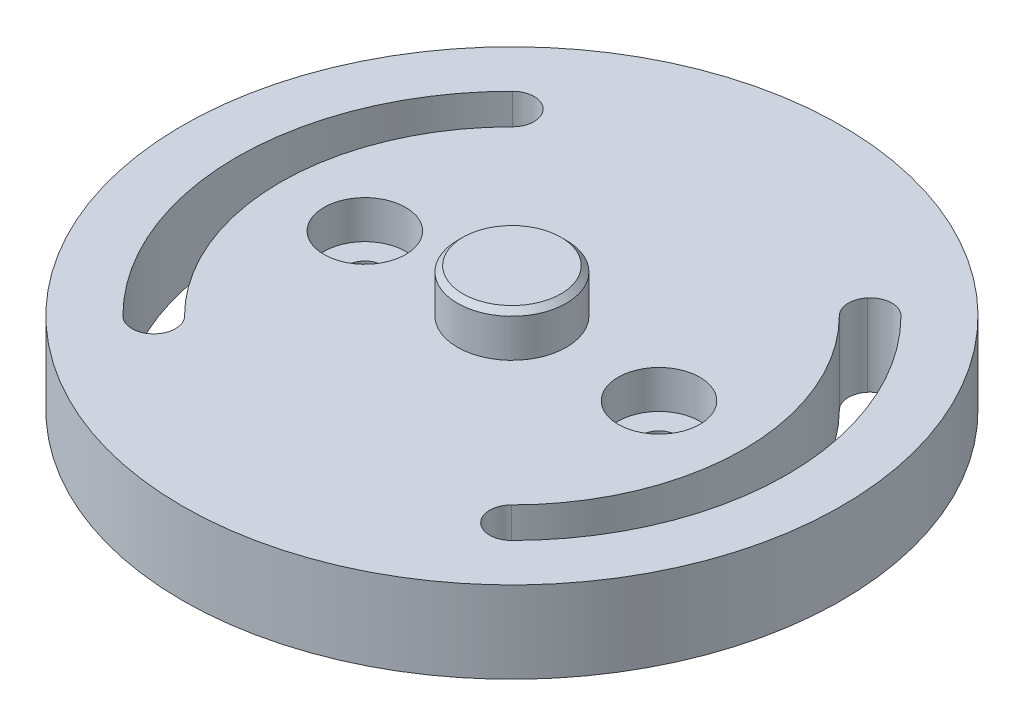
ISO-10303-21;
HEADER;
FILE_DESCRIPTION(('STEP AP214'),'2;1');
FILE_NAME('part.step','',(''),(''),'','','');
FILE_SCHEMA(('AUTOMOTIVE_DESIGN { 1 0 10303 214 1 1 1 1 }'));
ENDSEC;
DATA;
#1=APPLICATION_CONTEXT('core data for automotive mechanical design processes');
#2=APPLICATION_PROTOCOL_DEFINITION('international standard','automotive_design',2000,#1);
#3=PRODUCT_CONTEXT('',#1,'mechanical');
#4=PRODUCT('Part','Part','',(#3));
#5=PRODUCT_RELATED_PRODUCT_CATEGORY('part','',(#4));
#6=PRODUCT_DEFINITION_FORMATION('','',#4);
#7=PRODUCT_DEFINITION_CONTEXT('part definition',#1,'design');
#8=PRODUCT_DEFINITION('design','',#6,#7);
#9=PRODUCT_DEFINITION_SHAPE('','',#8);
#10=(LENGTH_UNIT() NAMED_UNIT(*) SI_UNIT(.MILLI.,.METRE.));
#11=(NAMED_UNIT(*) PLANE_ANGLE_UNIT() SI_UNIT($,.RADIAN.));
#12=(NAMED_UNIT(*) SI_UNIT($,.STERADIAN.) SOLID_ANGLE_UNIT());
#13=UNCERTAINTY_MEASURE_WITH_UNIT(LENGTH_MEASURE(1.E-05),#10,'distance_accuracy_value','');
#14=(GEOMETRIC_REPRESENTATION_CONTEXT(3) GLOBAL_UNCERTAINTY_ASSIGNED_CONTEXT((#13)) GLOBAL_UNIT_ASSIGNED_CONTEXT((#10,
#11,#12)) REPRESENTATION_CONTEXT('',''));
#15=CARTESIAN_POINT('',(0.,0.,0.));
#16=DIRECTION('',(0.,0.,1.));
#17=DIRECTION('',(1.,0.,0.));
#18=AXIS2_PLACEMENT_3D('',#15,#16,#17);
#19=CARTESIAN_POINT('',(0.,15.,0.));
#20=DIRECTION('',(0.,-1.,0.));
#21=DIRECTION('',(0.,0.,-1.));
#22=AXIS2_PLACEMENT_3D('',#19,#20,#21);
#23=CYLINDRICAL_SURFACE('',#22,42.5);
#24=CARTESIAN_POINT('',(0.,15.,0.));
#25=DIRECTION('',(0.,1.,0.));
#26=DIRECTION('',(0.,0.,1.));
#27=AXIS2_PLACEMENT_3D('',#24,#25,#26);
#28=CIRCLE('',#27,42.5);
#29=CARTESIAN_POINT('',(30.0178040791715,15.,30.0862333678458));
#30=VERTEX_POINT('',#29);
#31=CARTESIAN_POINT('',(30.0178040791715,15.,-30.0862333678458));
#32=VERTEX_POINT('',#31);
#33=EDGE_CURVE('E304',#30,#32,#28,.T.);
#34=ORIENTED_EDGE('',*,*,#33,.F.);
#35=DIRECTION('',(0.,-1.,0.));
#36=VECTOR('',#35,1.);
#37=CARTESIAN_POINT('',(30.0178040791715,15.,30.0862333678458));
#38=LINE('',#37,#36);
#39=CARTESIAN_POINT('',(30.0178040791715,0.,30.0862333678458));
#40=VERTEX_POINT('',#39);
#41=EDGE_CURVE('E165',#30,#40,#38,.T.);
#42=ORIENTED_EDGE('',*,*,#41,.T.);
#43=CARTESIAN_POINT('',(0.,0.,0.));
#44=DIRECTION('',(0.,1.,0.));
#45=DIRECTION('',(0.,0.,1.));
#46=AXIS2_PLACEMENT_3D('',#43,#44,#45);
#47=CIRCLE('',#46,42.5);
#48=CARTESIAN_POINT('',(30.0178040791715,0.,-30.0862333678458));
#49=VERTEX_POINT('',#48);
#50=EDGE_CURVE('E159',#40,#49,#47,.T.);
#51=ORIENTED_EDGE('',*,*,#50,.T.);
#52=DIRECTION('',(0.,-1.,0.));
#53=VECTOR('',#52,1.);
#54=CARTESIAN_POINT('',(30.0178040791715,15.,-30.0862333678458));
#55=LINE('',#54,#53);
#56=EDGE_CURVE('E163',#49,#32,#55,.F.);
#57=ORIENTED_EDGE('',*,*,#56,.T.);
#58=EDGE_LOOP('',(#34,#42,#51,#57));
#59=FACE_BOUND('',#58,.T.);
#60=ADVANCED_FACE('F43',(#59),#23,.T.);
#61=CARTESIAN_POINT('',(0.,15.,0.));
#62=DIRECTION('',(0.,-1.,0.));
#63=DIRECTION('',(0.,0.,-1.));
#64=AXIS2_PLACEMENT_3D('',#61,#62,#63);
#65=CYLINDRICAL_SURFACE('',#64,50.5);
#66=CARTESIAN_POINT('',(0.,0.,0.));
#67=DIRECTION('',(0.,1.,0.));
#68=DIRECTION('',(0.,0.,1.));
#69=AXIS2_PLACEMENT_3D('',#66,#67,#68);
#70=CIRCLE('',#69,50.5);
#71=CARTESIAN_POINT('',(35.6682142587802,0.,35.7495243547344));
#72=VERTEX_POINT('',#71);
#73=CARTESIAN_POINT('',(35.6682142587802,0.,-35.7495243547344));
#74=VERTEX_POINT('',#73);
#75=EDGE_CURVE('E139',#72,#74,#70,.T.);
#76=ORIENTED_EDGE('',*,*,#75,.F.);
#77=DIRECTION('',(0.,-1.,0.));
#78=VECTOR('',#77,1.);
#79=CARTESIAN_POINT('',(35.6682142587802,15.,35.7495243547344));
#80=LINE('',#79,#78);
#81=CARTESIAN_POINT('',(35.6682142587802,15.,35.7495243547344));
#82=VERTEX_POINT('',#81);
#83=EDGE_CURVE('E154',#72,#82,#80,.F.);
#84=ORIENTED_EDGE('',*,*,#83,.T.);
#85=CARTESIAN_POINT('',(0.,15.,0.));
#86=DIRECTION('',(0.,1.,0.));
#87=DIRECTION('',(0.,0.,1.));
#88=AXIS2_PLACEMENT_3D('',#85,#86,#87);
#89=CIRCLE('',#88,50.5);
#90=CARTESIAN_POINT('',(35.6682142587802,15.,-35.7495243547344));
#91=VERTEX_POINT('',#90);
#92=EDGE_CURVE('E303',#82,#91,#89,.T.);
#93=ORIENTED_EDGE('',*,*,#92,.T.);
#94=DIRECTION('',(0.,-1.,0.));
#95=VECTOR('',#94,1.);
#96=CARTESIAN_POINT('',(35.6682142587802,15.,-35.7495243547344));
#97=LINE('',#96,#95);
#98=EDGE_CURVE('E157',#91,#74,#97,.T.);
#99=ORIENTED_EDGE('',*,*,#98,.T.);
#100=EDGE_LOOP('',(#76,#84,#93,#99));
#101=FACE_BOUND('',#100,.T.);
#102=ADVANCED_FACE('F152',(#101),#65,.F.);
#103=CARTESIAN_POINT('',(-35.6682142587802,15.,-35.7495243547344));
#104=VERTEX_POINT('',#103);
#105=CARTESIAN_POINT('',(-35.6682142587802,15.,35.7495243547344));
#106=VERTEX_POINT('',#105);
#107=EDGE_CURVE('E276',#104,#106,#89,.T.);
#108=ORIENTED_EDGE('',*,*,#107,.T.);
#109=DIRECTION('',(0.,-1.,0.));
#110=VECTOR('',#109,1.);
#111=CARTESIAN_POINT('',(-35.6682142587802,15.,35.7495243547344));
#112=LINE('',#111,#110);
#113=CARTESIAN_POINT('',(-35.6682142587802,0.,35.7495243547344));
#114=VERTEX_POINT('',#113);
#115=EDGE_CURVE('E147',#106,#114,#112,.T.);
#116=ORIENTED_EDGE('',*,*,#115,.T.);
#117=CARTESIAN_POINT('',(-35.6682142587802,0.,-35.7495243547344));
#118=VERTEX_POINT('',#117);
#119=EDGE_CURVE('E161',#118,#114,#70,.T.);
#120=ORIENTED_EDGE('',*,*,#119,.F.);
#121=DIRECTION('',(0.,-1.,0.));
#122=VECTOR('',#121,1.);
#123=CARTESIAN_POINT('',(-35.6682142587802,15.,-35.7495243547344));
#124=LINE('',#123,#122);
#125=EDGE_CURVE('E178',#118,#104,#124,.F.);
#126=ORIENTED_EDGE('',*,*,#125,.T.);
#127=EDGE_LOOP('',(#108,#116,#120,#126));
#128=FACE_BOUND('',#127,.T.);
#129=ADVANCED_FACE('F239',(#128),#65,.F.);
#130=CARTESIAN_POINT('',(-30.0178040791715,0.,-30.0862333678458));
#131=VERTEX_POINT('',#130);
#132=CARTESIAN_POINT('',(-30.0178040791715,0.,30.0862333678458));
#133=VERTEX_POINT('',#132);
#134=EDGE_CURVE('E255',#131,#133,#47,.T.);
#135=ORIENTED_EDGE('',*,*,#134,.T.);
#136=DIRECTION('',(0.,-1.,0.));
#137=VECTOR('',#136,1.);
#138=CARTESIAN_POINT('',(-30.0178040791715,15.,30.0862333678458));
#139=LINE('',#138,#137);
#140=CARTESIAN_POINT('',(-30.0178040791715,15.,30.0862333678458));
#141=VERTEX_POINT('',#140);
#142=EDGE_CURVE('E175',#133,#141,#139,.F.);
#143=ORIENTED_EDGE('',*,*,#142,.T.);
#144=CARTESIAN_POINT('',(-30.0178040791715,15.,-30.0862333678458));
#145=VERTEX_POINT('',#144);
#146=EDGE_CURVE('E268',#145,#141,#28,.T.);
#147=ORIENTED_EDGE('',*,*,#146,.F.);
#148=DIRECTION('',(0.,-1.,0.));
#149=VECTOR('',#148,1.);
#150=CARTESIAN_POINT('',(-30.0178040791715,15.,-30.0862333678458));
#151=LINE('',#150,#149);
#152=EDGE_CURVE('E172',#145,#131,#151,.T.);
#153=ORIENTED_EDGE('',*,*,#152,.T.);
#154=EDGE_LOOP('',(#135,#143,#147,#153));
#155=FACE_BOUND('',#154,.T.);
#156=ADVANCED_FACE('F235',(#155),#23,.T.);
#157=CARTESIAN_POINT('',(0.,15.,0.));
#158=DIRECTION('',(0.,-1.,0.));
#159=DIRECTION('',(0.,0.,-1.));
#160=AXIS2_PLACEMENT_3D('',#157,#158,#159);
#161=CYLINDRICAL_SURFACE('',#160,60.5);
#162=CARTESIAN_POINT('',(0.,15.,0.));
#163=DIRECTION('',(0.,1.,0.));
#164=DIRECTION('',(0.,0.,1.));
#165=AXIS2_PLACEMENT_3D('',#162,#163,#164);
#166=CIRCLE('',#165,60.5);
#167=CARTESIAN_POINT('',(0.,15.,60.5));
#168=VERTEX_POINT('',#167);
#169=EDGE_CURVE('E167',#168,#168,#166,.T.);
#170=ORIENTED_EDGE('',*,*,#169,.F.);
#171=EDGE_LOOP('',(#170));
#172=FACE_BOUND('',#171,.T.);
#173=CARTESIAN_POINT('',(0.,0.,0.));
#174=DIRECTION('',(0.,1.,0.));
#175=DIRECTION('',(0.,0.,1.));
#176=AXIS2_PLACEMENT_3D('',#173,#174,#175);
#177=CIRCLE('',#176,60.5);
#178=CARTESIAN_POINT('',(0.,0.,60.5));
#179=VERTEX_POINT('',#178);
#180=EDGE_CURVE('E158',#179,#179,#177,.T.);
#181=ORIENTED_EDGE('',*,*,#180,.T.);
#182=EDGE_LOOP('',(#181));
#183=FACE_BOUND('',#182,.T.);
#184=ADVANCED_FACE('F244',(#172,#183),#161,.T.);
#185=CARTESIAN_POINT('',(0.,15.,0.));
#186=DIRECTION('',(0.,1.,0.));
#187=DIRECTION('',(0.,0.,1.));
#188=AXIS2_PLACEMENT_3D('',#185,#186,#187);
#189=PLANE('',#188);
#190=CARTESIAN_POINT('',(0.,15.,0.));
#191=DIRECTION('',(0.,1.,0.));
#192=DIRECTION('',(0.,0.,1.));
#193=AXIS2_PLACEMENT_3D('',#190,#191,#192);
#194=CIRCLE('',#193,10.);
#195=CARTESIAN_POINT('',(0.,15.,10.));
#196=VERTEX_POINT('',#195);
#197=EDGE_CURVE('E218',#196,#196,#194,.T.);
#198=ORIENTED_EDGE('',*,*,#197,.F.);
#199=EDGE_LOOP('',(#198));
#200=FACE_BOUND('',#199,.T.);
#201=CARTESIAN_POINT('',(-27.,15.,0.));
#202=DIRECTION('',(0.,1.,0.));
#203=DIRECTION('',(0.,0.,1.));
#204=AXIS2_PLACEMENT_3D('',#201,#202,#203);
#205=CIRCLE('',#204,7.5);
#206=CARTESIAN_POINT('',(-27.,15.,7.5));
#207=VERTEX_POINT('',#206);
#208=EDGE_CURVE('E279',#207,#207,#205,.T.);
#209=ORIENTED_EDGE('',*,*,#208,.F.);
#210=EDGE_LOOP('',(#209));
#211=FACE_BOUND('',#210,.T.);
#212=CARTESIAN_POINT('',(27.,15.,0.));
#213=DIRECTION('',(0.,1.,0.));
#214=DIRECTION('',(0.,0.,1.));
#215=AXIS2_PLACEMENT_3D('',#212,#213,#214);
#216=CIRCLE('',#215,7.5);
#217=CARTESIAN_POINT('',(27.,15.,7.5));
#218=VERTEX_POINT('',#217);
#219=EDGE_CURVE('E295',#218,#218,#216,.T.);
#220=ORIENTED_EDGE('',*,*,#219,.F.);
#221=EDGE_LOOP('',(#220));
#222=FACE_BOUND('',#221,.T.);
#223=ORIENTED_EDGE('',*,*,#107,.F.);
#224=CARTESIAN_POINT('',(-32.8430091689759,15.,-32.9178788612901));
#225=DIRECTION('',(0.,1.,0.));
#226=DIRECTION('',(0.,0.,1.));
#227=AXIS2_PLACEMENT_3D('',#224,#225,#226);
#228=CIRCLE('',#227,4.);
#229=CARTESIAN_POINT('',(-29.7788313964999,15.,-35.4890293000363));
#230=VERTEX_POINT('',#229);
#231=EDGE_CURVE('E59',#104,#230,#228,.F.);
#232=ORIENTED_EDGE('',*,*,#231,.T.);
#233=CARTESIAN_POINT('',(-32.8430091689759,15.,-32.9178788612901));
#234=DIRECTION('',(0.,1.,0.));
#235=DIRECTION('',(0.,0.,1.));
#236=AXIS2_PLACEMENT_3D('',#233,#234,#235);
#237=CIRCLE('',#236,4.);
#238=EDGE_CURVE('E202',#230,#145,#237,.F.);
#239=ORIENTED_EDGE('',*,*,#238,.T.);
#240=ORIENTED_EDGE('',*,*,#146,.T.);
#241=CARTESIAN_POINT('',(-32.8430091689759,15.,32.9178788612901));
#242=DIRECTION('',(0.,1.,0.));
#243=DIRECTION('',(0.,0.,1.));
#244=AXIS2_PLACEMENT_3D('',#241,#242,#243);
#245=CIRCLE('',#244,4.);
#246=CARTESIAN_POINT('',(-29.7788313964999,15.,35.4890293000362));
#247=VERTEX_POINT('',#246);
#248=EDGE_CURVE('E187',#141,#247,#245,.F.);
#249=ORIENTED_EDGE('',*,*,#248,.T.);
#250=CARTESIAN_POINT('',(-32.8430091689759,15.,32.9178788612901));
#251=DIRECTION('',(0.,1.,0.));
#252=DIRECTION('',(0.,0.,1.));
#253=AXIS2_PLACEMENT_3D('',#250,#251,#252);
#254=CIRCLE('',#253,4.);
#255=EDGE_CURVE('E191',#247,#106,#254,.F.);
#256=ORIENTED_EDGE('',*,*,#255,.T.);
#257=EDGE_LOOP('',(#223,#232,#239,#240,#249,#256));
#258=FACE_BOUND('',#257,.T.);
#259=CARTESIAN_POINT('',(32.8430091689759,15.,32.9178788612901));
#260=DIRECTION('',(0.,1.,0.));
#261=DIRECTION('',(0.,0.,1.));
#262=AXIS2_PLACEMENT_3D('',#259,#260,#261);
#263=CIRCLE('',#262,4.);
#264=CARTESIAN_POINT('',(29.7788313964999,15.,35.4890293000362));
#265=VERTEX_POINT('',#264);
#266=EDGE_CURVE('E146',#82,#265,#263,.F.);
#267=ORIENTED_EDGE('',*,*,#266,.T.);
#268=CARTESIAN_POINT('',(32.8430091689759,15.,32.9178788612901));
#269=DIRECTION('',(0.,1.,0.));
#270=DIRECTION('',(0.,0.,1.));
#271=AXIS2_PLACEMENT_3D('',#268,#269,#270);
#272=CIRCLE('',#271,4.);
#273=EDGE_CURVE('E183',#265,#30,#272,.F.);
#274=ORIENTED_EDGE('',*,*,#273,.T.);
#275=ORIENTED_EDGE('',*,*,#33,.T.);
#276=CARTESIAN_POINT('',(32.8430091689759,15.,-32.9178788612901));
#277=DIRECTION('',(0.,1.,0.));
#278=DIRECTION('',(0.,0.,1.));
#279=AXIS2_PLACEMENT_3D('',#276,#277,#278);
#280=CIRCLE('',#279,4.);
#281=CARTESIAN_POINT('',(29.7788313964999,15.,-35.4890293000362));
#282=VERTEX_POINT('',#281);
#283=EDGE_CURVE('E199',#32,#282,#280,.F.);
#284=ORIENTED_EDGE('',*,*,#283,.T.);
#285=CARTESIAN_POINT('',(32.8430091689759,15.,-32.9178788612901));
#286=DIRECTION('',(0.,1.,0.));
#287=DIRECTION('',(0.,0.,1.));
#288=AXIS2_PLACEMENT_3D('',#285,#286,#287);
#289=CIRCLE('',#288,4.);
#290=EDGE_CURVE('E195',#282,#91,#289,.F.);
#291=ORIENTED_EDGE('',*,*,#290,.T.);
#292=ORIENTED_EDGE('',*,*,#92,.F.);
#293=EDGE_LOOP('',(#267,#274,#275,#284,#291,#292));
#294=FACE_BOUND('',#293,.T.);
#295=ORIENTED_EDGE('',*,*,#169,.T.);
#296=EDGE_LOOP('',(#295));
#297=FACE_BOUND('',#296,.T.);
#298=ADVANCED_FACE('F250',(#200,#211,#222,#258,#294,#297),#189,.T.);
#299=CARTESIAN_POINT('',(0.,0.,0.));
#300=DIRECTION('',(0.,1.,0.));
#301=DIRECTION('',(0.,0.,1.));
#302=AXIS2_PLACEMENT_3D('',#299,#300,#301);
#303=PLANE('',#302);
#304=CARTESIAN_POINT('',(-27.,0.,0.));
#305=DIRECTION('',(0.,1.,0.));
#306=DIRECTION('',(0.,0.,1.));
#307=AXIS2_PLACEMENT_3D('',#304,#305,#306);
#308=CIRCLE('',#307,3.15);
#309=CARTESIAN_POINT('',(-27.,0.,3.15));
#310=VERTEX_POINT('',#309);
#311=EDGE_CURVE('E289',#310,#310,#308,.F.);
#312=ORIENTED_EDGE('',*,*,#311,.F.);
#313=EDGE_LOOP('',(#312));
#314=FACE_BOUND('',#313,.T.);
#315=CARTESIAN_POINT('',(27.,0.,0.));
#316=DIRECTION('',(0.,1.,0.));
#317=DIRECTION('',(0.,0.,1.));
#318=AXIS2_PLACEMENT_3D('',#315,#316,#317);
#319=CIRCLE('',#318,3.15);
#320=CARTESIAN_POINT('',(27.,0.,3.15));
#321=VERTEX_POINT('',#320);
#322=EDGE_CURVE('E209',#321,#321,#319,.F.);
#323=ORIENTED_EDGE('',*,*,#322,.F.);
#324=EDGE_LOOP('',(#323));
#325=FACE_BOUND('',#324,.T.);
#326=CARTESIAN_POINT('',(-32.8430091689759,0.,-32.9178788612901));
#327=DIRECTION('',(0.,1.,0.));
#328=DIRECTION('',(0.,0.,1.));
#329=AXIS2_PLACEMENT_3D('',#326,#327,#328);
#330=CIRCLE('',#329,4.);
#331=CARTESIAN_POINT('',(-29.7788313964999,0.,-35.4890293000363));
#332=VERTEX_POINT('',#331);
#333=EDGE_CURVE('E67',#131,#332,#330,.T.);
#334=ORIENTED_EDGE('',*,*,#333,.T.);
#335=CARTESIAN_POINT('',(-32.8430091689759,0.,-32.9178788612901));
#336=DIRECTION('',(0.,1.,0.));
#337=DIRECTION('',(0.,0.,1.));
#338=AXIS2_PLACEMENT_3D('',#335,#336,#337);
#339=CIRCLE('',#338,4.);
#340=EDGE_CURVE('E204',#332,#118,#339,.T.);
#341=ORIENTED_EDGE('',*,*,#340,.T.);
#342=ORIENTED_EDGE('',*,*,#119,.T.);
#343=CARTESIAN_POINT('',(-32.8430091689759,0.,32.9178788612901));
#344=DIRECTION('',(0.,1.,0.));
#345=DIRECTION('',(0.,0.,1.));
#346=AXIS2_PLACEMENT_3D('',#343,#344,#345);
#347=CIRCLE('',#346,4.);
#348=CARTESIAN_POINT('',(-29.7788313964999,0.,35.4890293000362));
#349=VERTEX_POINT('',#348);
#350=EDGE_CURVE('E189',#114,#349,#347,.T.);
#351=ORIENTED_EDGE('',*,*,#350,.T.);
#352=CARTESIAN_POINT('',(-32.8430091689759,0.,32.9178788612901));
#353=DIRECTION('',(0.,1.,0.));
#354=DIRECTION('',(0.,0.,1.));
#355=AXIS2_PLACEMENT_3D('',#352,#353,#354);
#356=CIRCLE('',#355,4.);
#357=EDGE_CURVE('E185',#349,#133,#356,.T.);
#358=ORIENTED_EDGE('',*,*,#357,.T.);
#359=ORIENTED_EDGE('',*,*,#134,.F.);
#360=EDGE_LOOP('',(#334,#341,#342,#351,#358,#359));
#361=FACE_BOUND('',#360,.T.);
#362=ORIENTED_EDGE('',*,*,#50,.F.);
#363=CARTESIAN_POINT('',(32.8430091689759,0.,32.9178788612901));
#364=DIRECTION('',(0.,1.,0.));
#365=DIRECTION('',(0.,0.,1.));
#366=AXIS2_PLACEMENT_3D('',#363,#364,#365);
#367=CIRCLE('',#366,4.);
#368=CARTESIAN_POINT('',(29.7788313964999,0.,35.4890293000362));
#369=VERTEX_POINT('',#368);
#370=EDGE_CURVE('E141',#40,#369,#367,.T.);
#371=ORIENTED_EDGE('',*,*,#370,.T.);
#372=CARTESIAN_POINT('',(32.8430091689759,0.,32.9178788612901));
#373=DIRECTION('',(0.,1.,0.));
#374=DIRECTION('',(0.,0.,1.));
#375=AXIS2_PLACEMENT_3D('',#372,#373,#374);
#376=CIRCLE('',#375,4.);
#377=EDGE_CURVE('E134',#369,#72,#376,.T.);
#378=ORIENTED_EDGE('',*,*,#377,.T.);
#379=ORIENTED_EDGE('',*,*,#75,.T.);
#380=CARTESIAN_POINT('',(32.8430091689759,0.,-32.9178788612901));
#381=DIRECTION('',(0.,1.,0.));
#382=DIRECTION('',(0.,0.,1.));
#383=AXIS2_PLACEMENT_3D('',#380,#381,#382);
#384=CIRCLE('',#383,4.);
#385=CARTESIAN_POINT('',(29.7788313964999,0.,-35.4890293000362));
#386=VERTEX_POINT('',#385);
#387=EDGE_CURVE('E193',#74,#386,#384,.T.);
#388=ORIENTED_EDGE('',*,*,#387,.T.);
#389=CARTESIAN_POINT('',(32.8430091689759,0.,-32.9178788612901));
#390=DIRECTION('',(0.,1.,0.));
#391=DIRECTION('',(0.,0.,1.));
#392=AXIS2_PLACEMENT_3D('',#389,#390,#391);
#393=CIRCLE('',#392,4.);
#394=EDGE_CURVE('E197',#386,#49,#393,.T.);
#395=ORIENTED_EDGE('',*,*,#394,.T.);
#396=EDGE_LOOP('',(#362,#371,#378,#379,#388,#395));
#397=FACE_BOUND('',#396,.T.);
#398=ORIENTED_EDGE('',*,*,#180,.F.);
#399=EDGE_LOOP('',(#398));
#400=FACE_BOUND('',#399,.T.);
#401=ADVANCED_FACE('F137',(#314,#325,#361,#397,#400),#303,.F.);
#402=CARTESIAN_POINT('',(27.,8.,0.));
#403=DIRECTION('',(0.,1.,0.));
#404=DIRECTION('',(0.,0.,1.));
#405=AXIS2_PLACEMENT_3D('',#402,#403,#404);
#406=CYLINDRICAL_SURFACE('',#405,7.5);
#407=CARTESIAN_POINT('',(27.,8.,0.));
#408=DIRECTION('',(0.,1.,0.));
#409=DIRECTION('',(0.,0.,1.));
#410=AXIS2_PLACEMENT_3D('',#407,#408,#409);
#411=CIRCLE('',#410,7.5);
#412=CARTESIAN_POINT('',(27.,8.,7.5));
#413=VERTEX_POINT('',#412);
#414=EDGE_CURVE('E291',#413,#413,#411,.T.);
#415=ORIENTED_EDGE('',*,*,#414,.F.);
#416=EDGE_LOOP('',(#415));
#417=FACE_BOUND('',#416,.T.);
#418=ORIENTED_EDGE('',*,*,#219,.T.);
#419=EDGE_LOOP('',(#418));
#420=FACE_BOUND('',#419,.T.);
#421=ADVANCED_FACE('F313',(#417,#420),#406,.F.);
#422=CARTESIAN_POINT('',(27.,8.,0.));
#423=DIRECTION('',(0.,1.,0.));
#424=DIRECTION('',(0.,0.,1.));
#425=AXIS2_PLACEMENT_3D('',#422,#423,#424);
#426=PLANE('',#425);
#427=CARTESIAN_POINT('',(27.,8.,0.));
#428=DIRECTION('',(0.,1.,0.));
#429=DIRECTION('',(0.,0.,1.));
#430=AXIS2_PLACEMENT_3D('',#427,#428,#429);
#431=CIRCLE('',#430,3.15);
#432=CARTESIAN_POINT('',(27.,8.,3.15));
#433=VERTEX_POINT('',#432);
#434=EDGE_CURVE('E288',#433,#433,#431,.T.);
#435=ORIENTED_EDGE('',*,*,#434,.F.);
#436=EDGE_LOOP('',(#435));
#437=FACE_BOUND('',#436,.T.);
#438=ORIENTED_EDGE('',*,*,#414,.T.);
#439=EDGE_LOOP('',(#438));
#440=FACE_BOUND('',#439,.T.);
#441=ADVANCED_FACE('F320',(#437,#440),#426,.T.);
#442=CARTESIAN_POINT('',(-27.,8.,0.));
#443=DIRECTION('',(0.,1.,0.));
#444=DIRECTION('',(0.,0.,1.));
#445=AXIS2_PLACEMENT_3D('',#442,#443,#444);
#446=CYLINDRICAL_SURFACE('',#445,7.5);
#447=CARTESIAN_POINT('',(-27.,8.,0.));
#448=DIRECTION('',(0.,1.,0.));
#449=DIRECTION('',(0.,0.,1.));
#450=AXIS2_PLACEMENT_3D('',#447,#448,#449);
#451=CIRCLE('',#450,7.5);
#452=CARTESIAN_POINT('',(-27.,8.,7.5));
#453=VERTEX_POINT('',#452);
#454=EDGE_CURVE('E277',#453,#453,#451,.T.);
#455=ORIENTED_EDGE('',*,*,#454,.F.);
#456=EDGE_LOOP('',(#455));
#457=FACE_BOUND('',#456,.T.);
#458=ORIENTED_EDGE('',*,*,#208,.T.);
#459=EDGE_LOOP('',(#458));
#460=FACE_BOUND('',#459,.T.);
#461=ADVANCED_FACE('F329',(#457,#460),#446,.F.);
#462=CARTESIAN_POINT('',(-27.,8.,0.));
#463=DIRECTION('',(0.,1.,0.));
#464=DIRECTION('',(0.,0.,1.));
#465=AXIS2_PLACEMENT_3D('',#462,#463,#464);
#466=PLANE('',#465);
#467=CARTESIAN_POINT('',(-27.,8.,0.));
#468=DIRECTION('',(0.,1.,0.));
#469=DIRECTION('',(0.,0.,1.));
#470=AXIS2_PLACEMENT_3D('',#467,#468,#469);
#471=CIRCLE('',#470,3.15);
#472=CARTESIAN_POINT('',(-27.,8.,3.15));
#473=VERTEX_POINT('',#472);
#474=EDGE_CURVE('E286',#473,#473,#471,.T.);
#475=ORIENTED_EDGE('',*,*,#474,.F.);
#476=EDGE_LOOP('',(#475));
#477=FACE_BOUND('',#476,.T.);
#478=ORIENTED_EDGE('',*,*,#454,.T.);
#479=EDGE_LOOP('',(#478));
#480=FACE_BOUND('',#479,.T.);
#481=ADVANCED_FACE('F334',(#477,#480),#466,.T.);
#482=CARTESIAN_POINT('',(-27.,-8.9095454429505,0.));
#483=DIRECTION('',(0.,1.,0.));
#484=DIRECTION('',(0.,0.,1.));
#485=AXIS2_PLACEMENT_3D('',#482,#483,#484);
#486=CYLINDRICAL_SURFACE('',#485,3.15);
#487=ORIENTED_EDGE('',*,*,#474,.T.);
#488=EDGE_LOOP('',(#487));
#489=FACE_BOUND('',#488,.T.);
#490=ORIENTED_EDGE('',*,*,#311,.T.);
#491=EDGE_LOOP('',(#490));
#492=FACE_BOUND('',#491,.T.);
#493=ADVANCED_FACE('F338',(#489,#492),#486,.F.);
#494=CARTESIAN_POINT('',(27.,-8.9095454429505,0.));
#495=DIRECTION('',(0.,1.,0.));
#496=DIRECTION('',(0.,0.,1.));
#497=AXIS2_PLACEMENT_3D('',#494,#495,#496);
#498=CYLINDRICAL_SURFACE('',#497,3.15);
#499=ORIENTED_EDGE('',*,*,#434,.T.);
#500=EDGE_LOOP('',(#499));
#501=FACE_BOUND('',#500,.T.);
#502=ORIENTED_EDGE('',*,*,#322,.T.);
#503=EDGE_LOOP('',(#502));
#504=FACE_BOUND('',#503,.T.);
#505=ADVANCED_FACE('F340',(#501,#504),#498,.F.);
#506=CARTESIAN_POINT('',(32.8430091689759,15.,32.9178788612901));
#507=DIRECTION('',(0.,-1.,0.));
#508=DIRECTION('',(0.,0.,-1.));
#509=AXIS2_PLACEMENT_3D('',#506,#507,#508);
#510=CYLINDRICAL_SURFACE('',#509,4.);
#511=ORIENTED_EDGE('',*,*,#41,.F.);
#512=ORIENTED_EDGE('',*,*,#273,.F.);
#513=DIRECTION('',(0.,-1.,0.));
#514=VECTOR('',#513,1.);
#515=CARTESIAN_POINT('',(29.7788313965,15.,35.4890293000362));
#516=LINE('',#515,#514);
#517=EDGE_CURVE('E207',#369,#265,#516,.F.);
#518=ORIENTED_EDGE('',*,*,#517,.F.);
#519=ORIENTED_EDGE('',*,*,#370,.F.);
#520=EDGE_LOOP('',(#511,#512,#518,#519));
#521=FACE_BOUND('',#520,.T.);
#522=ADVANCED_FACE('F343',(#521),#510,.F.);
#523=CARTESIAN_POINT('',(32.8430091689759,15.,32.9178788612901));
#524=DIRECTION('',(0.,-1.,0.));
#525=DIRECTION('',(0.,0.,-1.));
#526=AXIS2_PLACEMENT_3D('',#523,#524,#525);
#527=CYLINDRICAL_SURFACE('',#526,4.);
#528=ORIENTED_EDGE('',*,*,#266,.F.);
#529=ORIENTED_EDGE('',*,*,#83,.F.);
#530=ORIENTED_EDGE('',*,*,#377,.F.);
#531=ORIENTED_EDGE('',*,*,#517,.T.);
#532=EDGE_LOOP('',(#528,#529,#530,#531));
#533=FACE_BOUND('',#532,.T.);
#534=ADVANCED_FACE('F162',(#533),#527,.F.);
#535=CARTESIAN_POINT('',(-32.8430091689759,15.,32.9178788612901));
#536=DIRECTION('',(0.,-1.,0.));
#537=DIRECTION('',(0.,0.,-1.));
#538=AXIS2_PLACEMENT_3D('',#535,#536,#537);
#539=CYLINDRICAL_SURFACE('',#538,4.);
#540=ORIENTED_EDGE('',*,*,#115,.F.);
#541=ORIENTED_EDGE('',*,*,#255,.F.);
#542=DIRECTION('',(0.,-1.,0.));
#543=VECTOR('',#542,1.);
#544=CARTESIAN_POINT('',(-29.7788313964999,15.,35.4890293000362));
#545=LINE('',#544,#543);
#546=EDGE_CURVE('E210',#349,#247,#545,.F.);
#547=ORIENTED_EDGE('',*,*,#546,.F.);
#548=ORIENTED_EDGE('',*,*,#350,.F.);
#549=EDGE_LOOP('',(#540,#541,#547,#548));
#550=FACE_BOUND('',#549,.T.);
#551=ADVANCED_FACE('F271',(#550),#539,.F.);
#552=CARTESIAN_POINT('',(-32.8430091689759,15.,32.9178788612901));
#553=DIRECTION('',(0.,-1.,0.));
#554=DIRECTION('',(0.,0.,-1.));
#555=AXIS2_PLACEMENT_3D('',#552,#553,#554);
#556=CYLINDRICAL_SURFACE('',#555,4.);
#557=ORIENTED_EDGE('',*,*,#248,.F.);
#558=ORIENTED_EDGE('',*,*,#142,.F.);
#559=ORIENTED_EDGE('',*,*,#357,.F.);
#560=ORIENTED_EDGE('',*,*,#546,.T.);
#561=EDGE_LOOP('',(#557,#558,#559,#560));
#562=FACE_BOUND('',#561,.T.);
#563=ADVANCED_FACE('F263',(#562),#556,.F.);
#564=CARTESIAN_POINT('',(32.8430091689759,15.,-32.9178788612901));
#565=DIRECTION('',(0.,-1.,0.));
#566=DIRECTION('',(0.,0.,-1.));
#567=AXIS2_PLACEMENT_3D('',#564,#565,#566);
#568=CYLINDRICAL_SURFACE('',#567,4.);
#569=DIRECTION('',(0.,1.,0.));
#570=VECTOR('',#569,1.);
#571=CARTESIAN_POINT('',(29.7788313965,0.,-35.4890293000362));
#572=LINE('',#571,#570);
#573=EDGE_CURVE('E213',#282,#386,#572,.F.);
#574=ORIENTED_EDGE('',*,*,#573,.F.);
#575=ORIENTED_EDGE('',*,*,#283,.F.);
#576=ORIENTED_EDGE('',*,*,#56,.F.);
#577=ORIENTED_EDGE('',*,*,#394,.F.);
#578=EDGE_LOOP('',(#574,#575,#576,#577));
#579=FACE_BOUND('',#578,.T.);
#580=ADVANCED_FACE('F381',(#579),#568,.F.);
#581=CARTESIAN_POINT('',(32.8430091689759,15.,-32.9178788612901));
#582=DIRECTION('',(0.,-1.,0.));
#583=DIRECTION('',(0.,0.,-1.));
#584=AXIS2_PLACEMENT_3D('',#581,#582,#583);
#585=CYLINDRICAL_SURFACE('',#584,4.);
#586=ORIENTED_EDGE('',*,*,#290,.F.);
#587=ORIENTED_EDGE('',*,*,#573,.T.);
#588=ORIENTED_EDGE('',*,*,#387,.F.);
#589=ORIENTED_EDGE('',*,*,#98,.F.);
#590=EDGE_LOOP('',(#586,#587,#588,#589));
#591=FACE_BOUND('',#590,.T.);
#592=ADVANCED_FACE('F377',(#591),#585,.F.);
#593=CARTESIAN_POINT('',(-32.8430091689759,15.,-32.9178788612901));
#594=DIRECTION('',(0.,-1.,0.));
#595=DIRECTION('',(0.,0.,-1.));
#596=AXIS2_PLACEMENT_3D('',#593,#594,#595);
#597=CYLINDRICAL_SURFACE('',#596,4.);
#598=DIRECTION('',(0.,1.,0.));
#599=VECTOR('',#598,1.);
#600=CARTESIAN_POINT('',(-29.7788313964999,0.,-35.4890293000362));
#601=LINE('',#600,#599);
#602=EDGE_CURVE('E216',#230,#332,#601,.F.);
#603=ORIENTED_EDGE('',*,*,#602,.F.);
#604=ORIENTED_EDGE('',*,*,#231,.F.);
#605=ORIENTED_EDGE('',*,*,#125,.F.);
#606=ORIENTED_EDGE('',*,*,#340,.F.);
#607=EDGE_LOOP('',(#603,#604,#605,#606));
#608=FACE_BOUND('',#607,.T.);
#609=ADVANCED_FACE('F353',(#608),#597,.F.);
#610=CARTESIAN_POINT('',(-32.8430091689759,15.,-32.9178788612901));
#611=DIRECTION('',(0.,-1.,0.));
#612=DIRECTION('',(0.,0.,-1.));
#613=AXIS2_PLACEMENT_3D('',#610,#611,#612);
#614=CYLINDRICAL_SURFACE('',#613,4.);
#615=ORIENTED_EDGE('',*,*,#238,.F.);
#616=ORIENTED_EDGE('',*,*,#602,.T.);
#617=ORIENTED_EDGE('',*,*,#333,.F.);
#618=ORIENTED_EDGE('',*,*,#152,.F.);
#619=EDGE_LOOP('',(#615,#616,#617,#618));
#620=FACE_BOUND('',#619,.T.);
#621=ADVANCED_FACE('F348',(#620),#614,.F.);
#622=CARTESIAN_POINT('',(0.,23.,0.));
#623=DIRECTION('',(0.,-1.,0.));
#624=DIRECTION('',(0.,0.,-1.));
#625=AXIS2_PLACEMENT_3D('',#622,#623,#624);
#626=CYLINDRICAL_SURFACE('',#625,10.);
#627=CARTESIAN_POINT('',(0.,22.,0.));
#628=DIRECTION('',(0.,1.,0.));
#629=DIRECTION('',(0.,0.,1.));
#630=AXIS2_PLACEMENT_3D('',#627,#628,#629);
#631=CIRCLE('',#630,10.);
#632=CARTESIAN_POINT('',(0.,22.,10.));
#633=VERTEX_POINT('',#632);
#634=EDGE_CURVE('E11',#633,#633,#631,.F.);
#635=ORIENTED_EDGE('',*,*,#634,.T.);
#636=EDGE_LOOP('',(#635));
#637=FACE_BOUND('',#636,.T.);
#638=ORIENTED_EDGE('',*,*,#197,.T.);
#639=EDGE_LOOP('',(#638));
#640=FACE_BOUND('',#639,.T.);
#641=ADVANCED_FACE('F229',(#637,#640),#626,.T.);
#642=CARTESIAN_POINT('',(0.,23.,0.));
#643=DIRECTION('',(0.,1.,0.));
#644=DIRECTION('',(0.,0.,1.));
#645=AXIS2_PLACEMENT_3D('',#642,#643,#644);
#646=PLANE('',#645);
#647=CARTESIAN_POINT('',(0.,23.,0.));
#648=DIRECTION('',(0.,1.,0.));
#649=DIRECTION('',(0.,0.,1.));
#650=AXIS2_PLACEMENT_3D('',#647,#648,#649);
#651=CIRCLE('',#650,8.99999999999999);
#652=CARTESIAN_POINT('',(0.,23.,8.99999999999999));
#653=VERTEX_POINT('',#652);
#654=EDGE_CURVE('E52',#653,#653,#651,.T.);
#655=ORIENTED_EDGE('',*,*,#654,.T.);
#656=EDGE_LOOP('',(#655));
#657=FACE_BOUND('',#656,.T.);
#658=ADVANCED_FACE('F222',(#657),#646,.T.);
#659=CARTESIAN_POINT('',(0.,23.,0.));
#660=DIRECTION('',(0.,-1.,0.));
#661=DIRECTION('',(0.,0.,-1.));
#662=AXIS2_PLACEMENT_3D('',#659,#660,#661);
#663=CONICAL_SURFACE('',#662,8.99999999999999,0.785398163397458);
#664=ORIENTED_EDGE('',*,*,#634,.F.);
#665=EDGE_LOOP('',(#664));
#666=FACE_BOUND('',#665,.T.);
#667=ORIENTED_EDGE('',*,*,#654,.F.);
#668=EDGE_LOOP('',(#667));
#669=FACE_BOUND('',#668,.T.);
#670=ADVANCED_FACE('F46',(#666,#669),#663,.T.);
#671=CLOSED_SHELL('',(#60,#102,#129,#156,#184,#298,#401,#421,#441,#461,#481,#493,#505,#522,#534,
#551,#563,#580,#592,#609,#621,#641,#658,#670));
#672=MANIFOLD_SOLID_BREP('B2',#671);
#673=ADVANCED_BREP_SHAPE_REPRESENTATION('',(#18,#672),#14);
#674=SHAPE_DEFINITION_REPRESENTATION(#9,#673);
ENDSEC;
END-ISO-10303-21;
